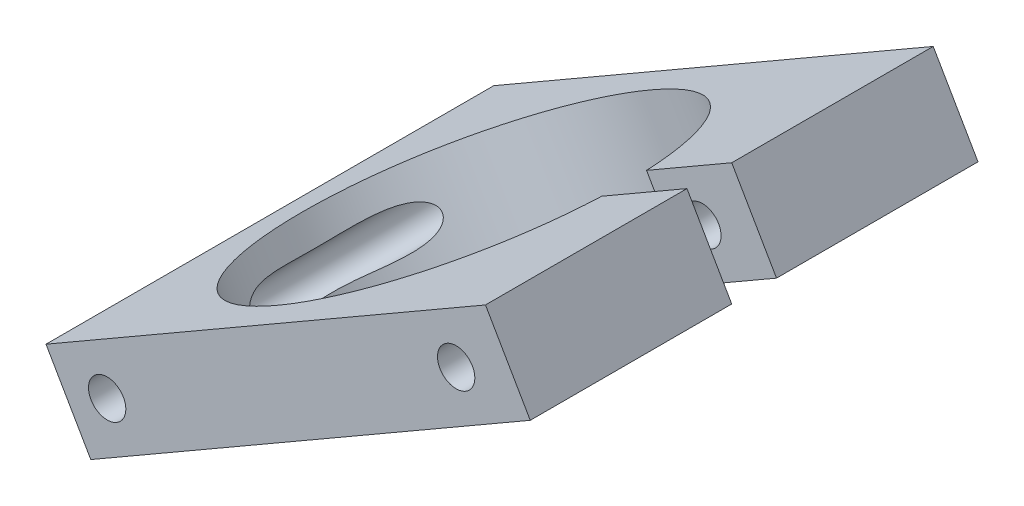
ISO-10303-21;
HEADER;
FILE_DESCRIPTION(('STEP AP214'),'2;1');
FILE_NAME('part.step','',(''),(''),'','','');
FILE_SCHEMA(('AUTOMOTIVE_DESIGN { 1 0 10303 214 1 1 1 1 }'));
ENDSEC;
DATA;
#1=APPLICATION_CONTEXT('core data for automotive mechanical design processes');
#2=APPLICATION_PROTOCOL_DEFINITION('international standard','automotive_design',2000,#1);
#3=PRODUCT_CONTEXT('',#1,'mechanical');
#4=PRODUCT('Part','Part','',(#3));
#5=PRODUCT_RELATED_PRODUCT_CATEGORY('part','',(#4));
#6=PRODUCT_DEFINITION_FORMATION('','',#4);
#7=PRODUCT_DEFINITION_CONTEXT('part definition',#1,'design');
#8=PRODUCT_DEFINITION('design','',#6,#7);
#9=PRODUCT_DEFINITION_SHAPE('','',#8);
#10=(LENGTH_UNIT() NAMED_UNIT(*) SI_UNIT(.MILLI.,.METRE.));
#11=(NAMED_UNIT(*) PLANE_ANGLE_UNIT() SI_UNIT($,.RADIAN.));
#12=(NAMED_UNIT(*) SI_UNIT($,.STERADIAN.) SOLID_ANGLE_UNIT());
#13=UNCERTAINTY_MEASURE_WITH_UNIT(LENGTH_MEASURE(1.E-05),#10,'distance_accuracy_value','');
#14=(GEOMETRIC_REPRESENTATION_CONTEXT(3) GLOBAL_UNCERTAINTY_ASSIGNED_CONTEXT((#13)) GLOBAL_UNIT_ASSIGNED_CONTEXT((#10,
#11,#12)) REPRESENTATION_CONTEXT('',''));
#15=CARTESIAN_POINT('',(0.,0.,0.));
#16=DIRECTION('',(0.,0.,1.));
#17=DIRECTION('',(1.,0.,0.));
#18=AXIS2_PLACEMENT_3D('',#15,#16,#17);
#19=CARTESIAN_POINT('',(53.9903810567648,603.817929175895,-386.357743681072));
#20=DIRECTION('',(0.,0.,-1.));
#21=DIRECTION('',(0.,1.,0.));
#22=AXIS2_PLACEMENT_3D('',#19,#20,#21);
#23=CYLINDRICAL_SURFACE('',#22,1.25);
#24=CARTESIAN_POINT('',(53.9903810567648,603.817929175895,-387.857743681072));
#25=DIRECTION('',(0.,0.,-1.));
#26=DIRECTION('',(0.,1.,0.));
#27=AXIS2_PLACEMENT_3D('',#24,#25,#26);
#28=CIRCLE('',#27,1.25);
#29=CARTESIAN_POINT('',(53.9903810567648,605.067929175895,-387.857743681072));
#30=VERTEX_POINT('',#29);
#31=EDGE_CURVE('E129',#30,#30,#28,.T.);
#32=ORIENTED_EDGE('',*,*,#31,.F.);
#33=EDGE_LOOP('',(#32));
#34=FACE_BOUND('',#33,.T.);
#35=CARTESIAN_POINT('',(53.9903810567648,603.817929175895,-401.357743681072));
#36=DIRECTION('',(0.,0.,-1.));
#37=DIRECTION('',(0.,1.,0.));
#38=AXIS2_PLACEMENT_3D('',#35,#36,#37);
#39=CIRCLE('',#38,1.25);
#40=CARTESIAN_POINT('',(53.9903810567648,605.067929175895,-401.357743681072));
#41=VERTEX_POINT('',#40);
#42=EDGE_CURVE('E147',#41,#41,#39,.T.);
#43=ORIENTED_EDGE('',*,*,#42,.T.);
#44=EDGE_LOOP('',(#43));
#45=FACE_BOUND('',#44,.T.);
#46=ADVANCED_FACE('F17',(#34,#45),#23,.F.);
#47=CARTESIAN_POINT('',(30.6076951545847,590.317929175895,-386.357743681072));
#48=DIRECTION('',(0.,0.,-1.));
#49=DIRECTION('',(0.,1.,0.));
#50=AXIS2_PLACEMENT_3D('',#47,#48,#49);
#51=CYLINDRICAL_SURFACE('',#50,1.25);
#52=CARTESIAN_POINT('',(31.6902269093152,590.942929175895,-392.736419092158));
#53=CARTESIAN_POINT('',(31.6712542976846,590.975786607273,-392.736415954482));
#54=CARTESIAN_POINT('',(31.6507622655719,591.007794771316,-392.733481741806));
#55=CARTESIAN_POINT('',(31.6074845193842,591.069152555091,-392.721998875564));
#56=CARTESIAN_POINT('',(31.5846961443096,591.098499013884,-392.713443643527));
#57=CARTESIAN_POINT('',(31.5378354571019,591.153778877972,-392.691473109543));
#58=CARTESIAN_POINT('',(31.5137727967481,591.179733883564,-392.678090836825));
#59=CARTESIAN_POINT('',(31.4649407412493,591.228324003287,-392.647285870885));
#60=CARTESIAN_POINT('',(31.4401711547139,591.250958207975,-392.629862074201));
#61=CARTESIAN_POINT('',(31.3739636054957,591.307004384488,-392.579119477516));
#62=CARTESIAN_POINT('',(31.3323627876158,591.3376123219,-392.542921400854));
#63=CARTESIAN_POINT('',(31.2501250278874,591.391340505114,-392.464366687458));
#64=CARTESIAN_POINT('',(31.2094915239816,591.414436930233,-392.421991063912));
#65=CARTESIAN_POINT('',(31.135477312987,591.451688723698,-392.339239642249));
#66=CARTESIAN_POINT('',(31.1018751560205,591.466641648179,-392.299408491014));
#67=CARTESIAN_POINT('',(31.0360801007506,591.492764403902,-392.217390405548));
#68=CARTESIAN_POINT('',(31.0038882991716,591.503931334993,-392.175201694062));
#69=CARTESIAN_POINT('',(30.9094768450197,591.53274747688,-392.045880474075));
#70=CARTESIAN_POINT('',(30.8494881663362,591.545681126031,-391.956069829444));
#71=CARTESIAN_POINT('',(30.7340969321448,591.562915335412,-391.769982309982));
#72=CARTESIAN_POINT('',(30.6788363192433,591.567004578957,-391.673602763512));
#73=CARTESIAN_POINT('',(30.5739986263102,591.568573337009,-391.477666883313));
#74=CARTESIAN_POINT('',(30.5244276143748,591.566045861762,-391.378107299982));
#75=CARTESIAN_POINT('',(30.4304649274881,591.556203632444,-391.176546350129));
#76=CARTESIAN_POINT('',(30.3860863273504,591.548877087328,-391.074539567204));
#77=CARTESIAN_POINT('',(30.3022244517657,591.530787142865,-390.868903153365));
#78=CARTESIAN_POINT('',(30.262739190048,591.5200251444,-390.765274200277));
#79=CARTESIAN_POINT('',(30.1813897125954,591.493901348095,-390.537516039531));
#80=CARTESIAN_POINT('',(30.1404243554549,591.478057557332,-390.413122917611));
#81=CARTESIAN_POINT('',(30.0641719972323,591.444347443082,-390.162862736092));
#82=CARTESIAN_POINT('',(30.0288864687356,591.426480597123,-390.036995303299));
#83=CARTESIAN_POINT('',(29.9634520294908,591.389777779715,-389.783935760656));
#84=CARTESIAN_POINT('',(29.933308553843,591.37094080989,-389.656742398103));
#85=CARTESIAN_POINT('',(29.8777398026052,591.3332075794,-389.401332739715));
#86=CARTESIAN_POINT('',(29.8523150743084,591.314311312115,-389.273116327021));
#87=CARTESIAN_POINT('',(29.7824933425284,591.258726160872,-388.887180746345));
#88=CARTESIAN_POINT('',(29.7445347151282,591.223132096093,-388.628119188459));
#89=CARTESIAN_POINT('',(29.6829672398777,591.160140124865,-388.107524553005));
#90=CARTESIAN_POINT('',(29.6593477252184,591.132736133576,-387.845993459963));
#91=CARTESIAN_POINT('',(29.6282046773068,591.094814305465,-387.379873878629));
#92=CARTESIAN_POINT('',(29.6182618788655,591.081889914004,-387.175640818059));
#93=CARTESIAN_POINT('',(29.6050941641375,591.064531071613,-386.766852730233));
#94=CARTESIAN_POINT('',(29.6018606041002,591.060085697459,-386.562298457445));
#95=CARTESIAN_POINT('',(29.6018603748356,591.060086142896,-386.148294362564));
#96=CARTESIAN_POINT('',(29.6052502953014,591.064747254184,-385.938844516084));
#97=CARTESIAN_POINT('',(29.6190549460035,591.082924661318,-385.52052600228));
#98=CARTESIAN_POINT('',(29.6294711089759,591.096442763197,-385.311657462217));
#99=CARTESIAN_POINT('',(29.658076028985,591.131087882679,-384.894287188887));
#100=CARTESIAN_POINT('',(29.6762943687451,591.152243811433,-384.685789915798));
#101=CARTESIAN_POINT('',(29.7215678150664,591.200178409304,-384.270439728651));
#102=CARTESIAN_POINT('',(29.7486216006178,591.226956237664,-384.063586573509));
#103=CARTESIAN_POINT('',(29.8130861500548,591.28382452542,-383.650786127465));
#104=CARTESIAN_POINT('',(29.8505522047719,591.313932137849,-383.444849807547));
#105=CARTESIAN_POINT('',(29.9374406087149,591.374372659823,-383.035347622215));
#106=CARTESIAN_POINT('',(29.9868704257778,591.404705698572,-382.831783320938));
#107=CARTESIAN_POINT('',(30.071224417899,591.447387035147,-382.529666772488));
#108=CARTESIAN_POINT('',(30.100923862872,591.46110183001,-382.429839224293));
#109=CARTESIAN_POINT('',(30.1640212471644,591.487039792191,-382.231169680477));
#110=CARTESIAN_POINT('',(30.1974186295211,591.499263183554,-382.132327538877));
#111=CARTESIAN_POINT('',(30.2681689260807,591.521505194476,-381.935954464242));
#112=CARTESIAN_POINT('',(30.3055167369318,591.531526608344,-381.838422018587));
#113=CARTESIAN_POINT('',(30.3845258600304,591.54851049702,-381.644865434439));
#114=CARTESIAN_POINT('',(30.4261855148307,591.555474141858,-381.548840732605));
#115=CARTESIAN_POINT('',(30.4915703676895,591.562708754496,-381.407594903611));
#116=CARTESIAN_POINT('',(30.5135098514463,591.56458003398,-381.361625675436));
#117=CARTESIAN_POINT('',(30.5585386694158,591.567165561227,-381.270224064769));
#118=CARTESIAN_POINT('',(30.5816280029285,591.567879809696,-381.22479168195));
#119=CARTESIAN_POINT('',(30.6529122679509,591.568021555181,-381.08900017262));
#120=CARTESIAN_POINT('',(30.7029352535289,591.565423978407,-380.999556589138));
#121=CARTESIAN_POINT('',(30.7902518241659,591.555018581878,-380.854071291457));
#122=CARTESIAN_POINT('',(30.8260936799124,591.549281563499,-380.797008844043));
#123=CARTESIAN_POINT('',(30.9001323912273,591.53382970333,-380.684891357617));
#124=CARTESIAN_POINT('',(30.9383309692258,591.524111922202,-380.62983783475));
#125=CARTESIAN_POINT('',(31.0168005631336,591.499796466121,-380.522877801885));
#126=CARTESIAN_POINT('',(31.0570564481365,591.485231011005,-380.470953118648));
#127=CARTESIAN_POINT('',(31.1396640890967,591.449973114851,-380.371063361451));
#128=CARTESIAN_POINT('',(31.1820113767418,591.429293302462,-380.323090384193));
#129=CARTESIAN_POINT('',(31.2563160516613,591.387073856797,-380.245411655401));
#130=CARTESIAN_POINT('',(31.2878810881587,591.367378957239,-380.214340262311));
#131=CARTESIAN_POINT('',(31.3515011473762,591.323290089821,-380.156136231997));
#132=CARTESIAN_POINT('',(31.3835565246722,591.298892557627,-380.129006609948));
#133=CARTESIAN_POINT('',(31.4478033378294,591.24448844767,-380.079785112983));
#134=CARTESIAN_POINT('',(31.4799914501878,591.214415452017,-380.057760582643));
#135=CARTESIAN_POINT('',(31.5427764337926,591.148691126009,-380.021039072499));
#136=CARTESIAN_POINT('',(31.5733783461319,591.11305912214,-380.006317418105));
#137=CARTESIAN_POINT('',(31.6181326825975,591.054272423855,-379.990478000768));
#138=CARTESIAN_POINT('',(31.6334395478382,591.032808016431,-379.986218317071));
#139=CARTESIAN_POINT('',(31.6628196698266,590.988685419216,-379.980512329085));
#140=CARTESIAN_POINT('',(31.6768928760688,590.96602718061,-379.979066139927));
#141=CARTESIAN_POINT('',(31.7091967582174,590.910068476414,-379.979071300344));
#142=CARTESIAN_POINT('',(31.7266705410666,590.876317702282,-379.982005689429));
#143=CARTESIAN_POINT('',(31.7581687018654,590.808159526799,-379.993488795394));
#144=CARTESIAN_POINT('',(31.7721891260331,590.773751420964,-380.002043906785));
#145=CARTESIAN_POINT('',(31.7966323535406,590.705529579073,-380.024014189993));
#146=CARTESIAN_POINT('',(31.8070786498028,590.671713404607,-380.037396388754));
#147=CARTESIAN_POINT('',(31.8247429142316,590.605128560024,-380.068201318227));
#148=CARTESIAN_POINT('',(31.8319599667148,590.572360189466,-380.085625192871));
#149=CARTESIAN_POINT('',(31.8473937604114,590.486998854148,-380.136368272726));
#150=CARTESIAN_POINT('',(31.8531006213553,590.435666918969,-380.172566850275));
#151=CARTESIAN_POINT('',(31.8585115615589,590.337582954619,-380.251121717076));
#152=CARTESIAN_POINT('',(31.8581968783765,590.290845696759,-380.29349684461));
#153=CARTESIAN_POINT('',(31.8534509107869,590.208124016238,-380.376245861509));
#154=CARTESIAN_POINT('',(31.8495997115077,590.171548926378,-380.416075004242));
#155=CARTESIAN_POINT('',(31.8393259047053,590.10151046885,-380.498088865035));
#156=CARTESIAN_POINT('',(31.8329013350788,590.068049499634,-380.540275359322));
#157=CARTESIAN_POINT('',(31.8106513472265,589.971876322429,-380.669598135095));
#158=CARTESIAN_POINT('',(31.7918570672581,589.913454705524,-380.759413054181));
#159=CARTESIAN_POINT('',(31.7490816953565,589.804893117378,-380.945522413983));
#160=CARTESIAN_POINT('',(31.7249878923575,589.75498311172,-381.041920146693));
#161=CARTESIAN_POINT('',(31.6739172467335,589.663393006969,-381.237892890135));
#162=CARTESIAN_POINT('',(31.6469373966145,589.621721624509,-381.337471137941));
#163=CARTESIAN_POINT('',(31.5914315935445,589.545274155638,-381.539032702268));
#164=CARTESIAN_POINT('',(31.5629025186309,589.510512704147,-381.641020622149));
#165=CARTESIAN_POINT('',(31.505315506728,589.446944784819,-381.846620245664));
#166=CARTESIAN_POINT('',(31.4762577812007,589.418135990505,-381.950231297833));
#167=CARTESIAN_POINT('',(31.4129869149723,589.360772339797,-382.17788961091));
#168=CARTESIAN_POINT('',(31.3788056637688,589.333233094423,-382.302199793624));
#169=CARTESIAN_POINT('',(31.3115288529095,589.284076376724,-382.552292242471));
#170=CARTESIAN_POINT('',(31.2784335750355,589.262460430811,-382.678074879359));
#171=CARTESIAN_POINT('',(31.2139713348997,589.224157657381,-382.930953895139));
#172=CARTESIAN_POINT('',(31.1826060898681,589.207475658138,-383.058051435751));
#173=CARTESIAN_POINT('',(31.1221789780482,589.17822290843,-383.313268281298));
#174=CARTESIAN_POINT('',(31.0931173752639,589.165652628666,-383.441387701498));
#175=CARTESIAN_POINT('',(31.0100348830674,589.132945725912,-383.82736212664));
#176=CARTESIAN_POINT('',(30.9601875238648,589.117850764193,-384.086561571914));
#177=CARTESIAN_POINT('',(30.8747680573524,589.095996260358,-384.607521193495));
#178=CARTESIAN_POINT('',(30.8391895527119,589.089232979973,-384.869280168213));
#179=CARTESIAN_POINT('',(30.7957598230708,589.082053737164,-385.287386094102));
#180=CARTESIAN_POINT('',(30.7825184842412,589.080173863518,-385.443161407016));
#181=CARTESIAN_POINT('',(30.7621789167057,589.077468024626,-385.755131046195));
#182=CARTESIAN_POINT('',(30.7550807835504,589.076642075772,-385.91132537894));
#183=CARTESIAN_POINT('',(30.7472243564328,589.075734872899,-386.223906715576));
#184=CARTESIAN_POINT('',(30.7464673281852,589.075653767554,-386.380293751702));
#185=CARTESIAN_POINT('',(30.751316475123,589.076205003683,-386.692965774246));
#186=CARTESIAN_POINT('',(30.7569225800334,589.076837337279,-386.849250761774));
#187=CARTESIAN_POINT('',(30.7743294434003,589.079055010686,-387.161202639928));
#188=CARTESIAN_POINT('',(30.7861197716331,589.080638746528,-387.31687012797));
#189=CARTESIAN_POINT('',(30.8155808184862,589.085247061452,-387.627630114726));
#190=CARTESIAN_POINT('',(30.8332517750603,589.088271698841,-387.782722589915));
#191=CARTESIAN_POINT('',(30.8740350057707,589.096456737677,-388.092087801964));
#192=CARTESIAN_POINT('',(30.8971457720606,589.101616547582,-388.246360753889));
#193=CARTESIAN_POINT('',(30.9482801222771,589.114932985222,-388.553945229169));
#194=CARTESIAN_POINT('',(30.9763031769517,589.123089290217,-388.707256854257));
#195=CARTESIAN_POINT('',(31.0280913344314,589.140522389102,-388.969429208505));
#196=CARTESIAN_POINT('',(31.0508092534244,589.148824977715,-389.078562324954));
#197=CARTESIAN_POINT('',(31.0981902300189,589.167901228078,-389.296165819672));
#198=CARTESIAN_POINT('',(31.1228530019451,589.178674527353,-389.404636292763));
#199=CARTESIAN_POINT('',(31.1994393704343,589.215399913258,-389.72929475983));
#200=CARTESIAN_POINT('',(31.2539026929711,589.245740629649,-389.944441170725));
#201=CARTESIAN_POINT('',(31.3436897256474,589.30677683686,-390.283773312812));
#202=CARTESIAN_POINT('',(31.3777505744604,589.332271345495,-390.409238007981));
#203=CARTESIAN_POINT('',(31.44642090134,589.389997929595,-390.65844368276));
#204=CARTESIAN_POINT('',(31.4810302080519,589.422227937597,-390.782185178901));
#205=CARTESIAN_POINT('',(31.5496257135583,589.494674111143,-391.027060577142));
#206=CARTESIAN_POINT('',(31.5836135225004,589.534864986743,-391.148201423692));
#207=CARTESIAN_POINT('',(31.6495384134478,589.624972363854,-391.387333716643));
#208=CARTESIAN_POINT('',(31.6814776591947,589.674878371377,-391.505328406447));
#209=CARTESIAN_POINT('',(31.7303992342028,589.766843698571,-391.695652926489));
#210=CARTESIAN_POINT('',(31.7486683798876,589.805407249645,-391.769334634444));
#211=CARTESIAN_POINT('',(31.7824256430866,589.888370252853,-391.914179772449));
#212=CARTESIAN_POINT('',(31.7979104456304,589.932776553764,-391.985340120787));
#213=CARTESIAN_POINT('',(31.8247881526732,590.02864350687,-392.124417879131));
#214=CARTESIAN_POINT('',(31.8361504443113,590.08015316599,-392.192307906016));
#215=CARTESIAN_POINT('',(31.8524913382811,590.19097632579,-392.322241559134));
#216=CARTESIAN_POINT('',(31.8574866480543,590.250268949999,-392.384300089147));
#217=CARTESIAN_POINT('',(31.8578021233147,590.349641328038,-392.473973059981));
#218=CARTESIAN_POINT('',(31.8563949655879,590.386802718807,-392.504793571012));
#219=CARTESIAN_POINT('',(31.849749309907,590.46386877813,-392.562471875908));
#220=CARTESIAN_POINT('',(31.8445087033643,590.503774945499,-392.589327479102));
#221=CARTESIAN_POINT('',(31.8292405689891,590.586474730671,-392.637985922234));
#222=CARTESIAN_POINT('',(31.8191532629342,590.629298513959,-392.659720470505));
#223=CARTESIAN_POINT('',(31.7933744397022,590.716300954233,-392.695856818427));
#224=CARTESIAN_POINT('',(31.777702463367,590.760474402097,-392.710283766546));
#225=CARTESIAN_POINT('',(31.7492484297674,590.827840029359,-392.725572200945));
#226=CARTESIAN_POINT('',(31.7385261951859,590.851211329805,-392.729622326244));
#227=CARTESIAN_POINT('',(31.7155162076754,590.897497777168,-392.735046964606));
#228=CARTESIAN_POINT('',(31.7032283171439,590.920412883786,-392.736421242321));
#229=CARTESIAN_POINT('',(31.6902269093152,590.942929175895,-392.736419092158));
#230=B_SPLINE_CURVE_WITH_KNOTS('',3,(#52,#53,#54,#55,#56,#57,#58,#59,#60,#61,#62,#63,#64,#65,
#66,#67,#68,#69,#70,#71,#72,#73,#74,#75,#76,#77,#78,#79,#80,#81,#82,#83,#84,#85,#86,#87,#88,#89,
#90,#91,#92,#93,#94,#95,#96,#97,#98,#99,#100,#101,#102,#103,#104,#105,#106,#107,#108,#109,#110,
#111,#112,#113,#114,#115,#116,#117,#118,#119,#120,#121,#122,#123,#124,#125,#126,#127,#128,#129,
#130,#131,#132,#133,#134,#135,#136,#137,#138,#139,#140,#141,#142,#143,#144,#145,#146,#147,#148,
#149,#150,#151,#152,#153,#154,#155,#156,#157,#158,#159,#160,#161,#162,#163,#164,#165,#166,#167,
#168,#169,#170,#171,#172,#173,#174,#175,#176,#177,#178,#179,#180,#181,#182,#183,#184,#185,#186,
#187,#188,#189,#190,#191,#192,#193,#194,#195,#196,#197,#198,#199,#200,#201,#202,#203,#204,#205,
#206,#207,#208,#209,#210,#211,#212,#213,#214,#215,#216,#217,#218,#219,#220,#221,#222,#223,#224,
#225,#226,#227,#228,#229),.UNSPECIFIED.,.T.,.F.,(4,2,2,2,2,2,2,2,2,2,2,2,2,2,2,2,2,2,2,2,2,2,2,
2,2,2,2,2,2,2,2,2,2,2,2,2,2,2,2,2,2,2,2,2,2,2,2,2,2,2,2,2,2,2,2,2,2,2,2,2,2,2,2,2,2,2,2,2,2,2,2,
2,2,2,2,2,2,2,2,2,2,2,2,2,2,2,2,2,4),(0.,0.113721890322113,0.22757711090348,0.340667608492749,
0.453789019754883,0.641912274934925,0.830626422084285,0.993034505980874,1.1555667182889,
1.48094764319103,1.8140206610741,2.14744567180063,2.4816929774268,2.81580416015053,
3.21138556181623,3.60706935960646,4.00316883417094,4.39931422076172,5.19142999368265,
5.98295579047496,6.5973378339562,7.21092785445144,7.83919972330965,8.46759974317051,
9.09840379712595,9.72911358112095,10.3632387257238,10.9977607197235,11.3128502480869,
11.6278923838019,11.9425323919409,12.2570519003811,12.4099373098438,12.5628226262341,
12.8699456203727,13.0726891086871,13.2755825705648,13.4771535795313,13.6783111360099,
13.8234251775952,13.9686496432008,14.1156928119731,14.2622357159916,14.342169629119,
14.422106813177,14.5358305661646,14.649683923534,14.7627738543585,14.8758958326349,
15.0640213961674,15.2527332326041,15.4151334377518,15.5776577036934,15.9030544333831,
16.2361888414609,16.5696738482144,16.9038578068534,17.2379109083135,17.6332305486884,
18.0286519658362,18.4244590647182,18.8203114588481,19.6128646814015,20.4050621705397,
20.8739969727795,21.3429390686485,21.8119747653572,22.2810052820382,22.7492472701274,
23.2175082074618,23.6856395013128,24.1537203894598,24.4890183952029,24.8242672411837,
25.4956485398557,25.8929566697944,26.2901430246809,26.6860872769548,27.081606192015,
27.3368315385907,27.5923587667408,27.8497464209335,28.1064572705239,28.2510537321592,
28.3957297889417,28.542237933887,28.6882383986824,28.7661620224346,28.8440924994774),.UNSPECIFIED.);
#231=CARTESIAN_POINT('',(31.6902269093152,590.942929175895,-392.736419092158));
#232=VERTEX_POINT('',#231);
#233=EDGE_CURVE('E88',#232,#232,#230,.T.);
#234=ORIENTED_EDGE('',*,*,#233,.T.);
#235=EDGE_LOOP('',(#234));
#236=FACE_BOUND('',#235,.T.);
#237=CARTESIAN_POINT('',(30.6076951545847,590.317929175895,-401.357743681072));
#238=DIRECTION('',(0.,0.,-1.));
#239=DIRECTION('',(0.,1.,0.));
#240=AXIS2_PLACEMENT_3D('',#237,#238,#239);
#241=CIRCLE('',#240,1.25);
#242=CARTESIAN_POINT('',(30.6076951545847,591.567929175895,-401.357743681072));
#243=VERTEX_POINT('',#242);
#244=EDGE_CURVE('E144',#243,#243,#241,.T.);
#245=ORIENTED_EDGE('',*,*,#244,.T.);
#246=EDGE_LOOP('',(#245));
#247=FACE_BOUND('',#246,.T.);
#248=CARTESIAN_POINT('',(30.6076951545847,590.317929175895,-371.357743681072));
#249=DIRECTION('',(0.,0.,-1.));
#250=DIRECTION('',(0.,1.,0.));
#251=AXIS2_PLACEMENT_3D('',#248,#249,#250);
#252=CIRCLE('',#251,1.25);
#253=CARTESIAN_POINT('',(30.6076951545847,591.567929175895,-371.357743681072));
#254=VERTEX_POINT('',#253);
#255=EDGE_CURVE('E139',#254,#254,#252,.F.);
#256=ORIENTED_EDGE('',*,*,#255,.T.);
#257=EDGE_LOOP('',(#256));
#258=FACE_BOUND('',#257,.T.);
#259=ADVANCED_FACE('F156',(#236,#247,#258),#51,.F.);
#260=CARTESIAN_POINT('',(55.9544826719027,608.416005387248,-371.357743681072));
#261=DIRECTION('',(-0.500000000000001,0.866025403784438,0.));
#262=DIRECTION('',(-0.866025403784438,-0.500000000000001,0.));
#263=AXIS2_PLACEMENT_3D('',#260,#261,#262);
#264=PLANE('',#263);
#265=DIRECTION('',(0.866025403784439,0.499999999999999,0.));
#266=VECTOR('',#265,1.);
#267=CARTESIAN_POINT('',(26.5096189432315,591.416005387248,-371.357743681072));
#268=LINE('',#267,#266);
#269=CARTESIAN_POINT('',(26.5096189432315,591.416005387248,-371.357743681072));
#270=VERTEX_POINT('',#269);
#271=CARTESIAN_POINT('',(55.9544826719024,608.416005387248,-371.357743681072));
#272=VERTEX_POINT('',#271);
#273=EDGE_CURVE('E109',#270,#272,#268,.T.);
#274=ORIENTED_EDGE('',*,*,#273,.T.);
#275=DIRECTION('',(0.,0.,1.));
#276=VECTOR('',#275,1.);
#277=CARTESIAN_POINT('',(55.9544826719024,608.416005387248,-384.857743681072));
#278=LINE('',#277,#276);
#279=CARTESIAN_POINT('',(55.9544826719025,608.416005387248,-384.857743681072));
#280=VERTEX_POINT('',#279);
#281=EDGE_CURVE('E94',#272,#280,#278,.F.);
#282=ORIENTED_EDGE('',*,*,#281,.T.);
#283=DIRECTION('',(0.86602540378448,0.499999999999929,0.));
#284=VECTOR('',#283,1.);
#285=CARTESIAN_POINT('',(50.2470926301003,605.120842210244,-384.857743681072));
#286=LINE('',#285,#284);
#287=CARTESIAN_POINT('',(50.2470926301006,605.120842210243,-384.857743681072));
#288=VERTEX_POINT('',#287);
#289=EDGE_CURVE('E90',#288,#280,#286,.T.);
#290=ORIENTED_EDGE('',*,*,#289,.F.);
#291=CARTESIAN_POINT('',(39.4999999999981,598.916005387249,-386.357743681072));
#292=DIRECTION('',(0.499999999999999,-0.866025403784439,0.));
#293=DIRECTION('',(0.866025403784439,0.499999999999999,0.));
#294=AXIS2_PLACEMENT_3D('',#291,#292,#293);
#295=CIRCLE('',#294,12.5);
#296=CARTESIAN_POINT('',(50.2470926301006,605.120842210243,-387.857743681072));
#297=VERTEX_POINT('',#296);
#298=EDGE_CURVE('E20',#288,#297,#295,.T.);
#299=ORIENTED_EDGE('',*,*,#298,.T.);
#300=DIRECTION('',(-0.86602540378448,-0.499999999999929,0.));
#301=VECTOR('',#300,1.);
#302=CARTESIAN_POINT('',(55.9544826719025,608.416005387248,-387.857743681072));
#303=LINE('',#302,#301);
#304=CARTESIAN_POINT('',(55.9544826719024,608.416005387248,-387.857743681072));
#305=VERTEX_POINT('',#304);
#306=EDGE_CURVE('E132',#305,#297,#303,.T.);
#307=ORIENTED_EDGE('',*,*,#306,.F.);
#308=DIRECTION('',(0.,0.,1.));
#309=VECTOR('',#308,1.);
#310=CARTESIAN_POINT('',(55.9544826719024,608.416005387248,-401.357743681072));
#311=LINE('',#310,#309);
#312=CARTESIAN_POINT('',(55.9544826719025,608.416005387248,-401.357743681072));
#313=VERTEX_POINT('',#312);
#314=EDGE_CURVE('E126',#305,#313,#311,.F.);
#315=ORIENTED_EDGE('',*,*,#314,.T.);
#316=DIRECTION('',(-0.866025403784439,-0.499999999999999,0.));
#317=VECTOR('',#316,1.);
#318=CARTESIAN_POINT('',(55.9544826719025,608.416005387248,-401.357743681072));
#319=LINE('',#318,#317);
#320=CARTESIAN_POINT('',(26.5096189432314,591.416005387248,-401.357743681072));
#321=VERTEX_POINT('',#320);
#322=EDGE_CURVE('E120',#313,#321,#319,.T.);
#323=ORIENTED_EDGE('',*,*,#322,.T.);
#324=DIRECTION('',(0.,0.,1.));
#325=VECTOR('',#324,1.);
#326=CARTESIAN_POINT('',(26.5096189432314,591.416005387248,-401.357743681072));
#327=LINE('',#326,#325);
#328=EDGE_CURVE('E115',#321,#270,#327,.T.);
#329=ORIENTED_EDGE('',*,*,#328,.T.);
#330=EDGE_LOOP('',(#274,#282,#290,#299,#307,#315,#323,#329));
#331=FACE_BOUND('',#330,.T.);
#332=ADVANCED_FACE('F92',(#331),#264,.T.);
#333=CARTESIAN_POINT('',(53.9903810567648,603.817929175895,-386.357743681072));
#334=DIRECTION('',(0.,0.,-1.));
#335=DIRECTION('',(0.,1.,0.));
#336=AXIS2_PLACEMENT_3D('',#333,#334,#335);
#337=CYLINDRICAL_SURFACE('',#336,1.25);
#338=CARTESIAN_POINT('',(53.9903810567648,603.817929175895,-371.357743681072));
#339=DIRECTION('',(0.,0.,-1.));
#340=DIRECTION('',(0.,1.,0.));
#341=AXIS2_PLACEMENT_3D('',#338,#339,#340);
#342=CIRCLE('',#341,1.25);
#343=CARTESIAN_POINT('',(53.9903810567648,605.067929175895,-371.357743681072));
#344=VERTEX_POINT('',#343);
#345=EDGE_CURVE('E111',#344,#344,#342,.F.);
#346=ORIENTED_EDGE('',*,*,#345,.T.);
#347=EDGE_LOOP('',(#346));
#348=FACE_BOUND('',#347,.T.);
#349=CARTESIAN_POINT('',(53.9903810567648,603.817929175895,-384.857743681072));
#350=DIRECTION('',(0.,0.,-1.));
#351=DIRECTION('',(0.,1.,0.));
#352=AXIS2_PLACEMENT_3D('',#349,#350,#351);
#353=CIRCLE('',#352,1.25);
#354=CARTESIAN_POINT('',(53.9903810567648,605.067929175895,-384.857743681072));
#355=VERTEX_POINT('',#354);
#356=EDGE_CURVE('E95',#355,#355,#353,.F.);
#357=ORIENTED_EDGE('',*,*,#356,.F.);
#358=EDGE_LOOP('',(#357));
#359=FACE_BOUND('',#358,.T.);
#360=ADVANCED_FACE('F164',(#348,#359),#337,.F.);
#361=CARTESIAN_POINT('',(40.9999999999982,596.317929175895,-386.357743681072));
#362=DIRECTION('',(0.499999999999999,-0.866025403784439,0.));
#363=DIRECTION('',(0.866025403784439,0.499999999999999,0.));
#364=AXIS2_PLACEMENT_3D('',#361,#362,#363);
#365=CYLINDRICAL_SURFACE('',#364,12.5);
#366=ORIENTED_EDGE('',*,*,#233,.F.);
#367=EDGE_LOOP('',(#366));
#368=FACE_BOUND('',#367,.T.);
#369=CARTESIAN_POINT('',(42.4999999999982,593.719852964542,-386.357743681072));
#370=DIRECTION('',(0.499999999999999,-0.866025403784439,0.));
#371=DIRECTION('',(0.866025403784439,0.499999999999999,0.));
#372=AXIS2_PLACEMENT_3D('',#369,#370,#371);
#373=CIRCLE('',#372,12.5);
#374=CARTESIAN_POINT('',(53.2470926301003,599.924689787537,-384.857743681072));
#375=VERTEX_POINT('',#374);
#376=CARTESIAN_POINT('',(53.2470926301003,599.924689787537,-387.857743681072));
#377=VERTEX_POINT('',#376);
#378=EDGE_CURVE('E98',#375,#377,#373,.T.);
#379=ORIENTED_EDGE('',*,*,#378,.T.);
#380=DIRECTION('',(0.499999999999975,-0.866025403784453,0.));
#381=VECTOR('',#380,1.);
#382=CARTESIAN_POINT('',(50.2470926301003,605.120842210244,-387.857743681072));
#383=LINE('',#382,#381);
#384=EDGE_CURVE('E84',#297,#377,#383,.T.);
#385=ORIENTED_EDGE('',*,*,#384,.F.);
#386=ORIENTED_EDGE('',*,*,#298,.F.);
#387=DIRECTION('',(-0.499999999999975,0.866025403784453,0.));
#388=VECTOR('',#387,1.);
#389=CARTESIAN_POINT('',(53.2470926301003,599.924689787537,-384.857743681072));
#390=LINE('',#389,#388);
#391=EDGE_CURVE('E83',#375,#288,#390,.T.);
#392=ORIENTED_EDGE('',*,*,#391,.F.);
#393=EDGE_LOOP('',(#379,#385,#386,#392));
#394=FACE_BOUND('',#393,.T.);
#395=ADVANCED_FACE('F82',(#368,#394),#365,.F.);
#396=CARTESIAN_POINT('',(55.2894191624414,604.567929175895,-387.857743681072));
#397=DIRECTION('',(0.,0.,1.));
#398=DIRECTION('',(1.,0.,0.));
#399=AXIS2_PLACEMENT_3D('',#396,#397,#398);
#400=PLANE('',#399);
#401=ORIENTED_EDGE('',*,*,#31,.T.);
#402=EDGE_LOOP('',(#401));
#403=FACE_BOUND('',#402,.T.);
#404=ORIENTED_EDGE('',*,*,#384,.T.);
#405=DIRECTION('',(-0.866025403784438,-0.500000000000001,0.));
#406=VECTOR('',#405,1.);
#407=CARTESIAN_POINT('',(58.9544826719025,603.219852964542,-387.857743681072));
#408=LINE('',#407,#406);
#409=CARTESIAN_POINT('',(58.9544826719024,603.219852964542,-387.857743681072));
#410=VERTEX_POINT('',#409);
#411=EDGE_CURVE('E137',#377,#410,#408,.F.);
#412=ORIENTED_EDGE('',*,*,#411,.T.);
#413=DIRECTION('',(0.499999999999996,-0.866025403784441,0.));
#414=VECTOR('',#413,1.);
#415=CARTESIAN_POINT('',(55.9544826719024,608.416005387248,-387.857743681072));
#416=LINE('',#415,#414);
#417=EDGE_CURVE('E123',#410,#305,#416,.F.);
#418=ORIENTED_EDGE('',*,*,#417,.T.);
#419=ORIENTED_EDGE('',*,*,#306,.T.);
#420=EDGE_LOOP('',(#404,#412,#418,#419));
#421=FACE_BOUND('',#420,.T.);
#422=ADVANCED_FACE('F163',(#403,#421),#400,.T.);
#423=CARTESIAN_POINT('',(55.9544826719024,608.416005387248,-401.357743681072));
#424=DIRECTION('',(-0.866025403784441,-0.499999999999996,0.));
#425=DIRECTION('',(0.499999999999996,-0.866025403784441,0.));
#426=AXIS2_PLACEMENT_3D('',#423,#424,#425);
#427=PLANE('',#426);
#428=DIRECTION('',(0.,0.,1.));
#429=VECTOR('',#428,1.);
#430=CARTESIAN_POINT('',(58.9544826719025,603.219852964542,-371.357743681072));
#431=LINE('',#430,#429);
#432=CARTESIAN_POINT('',(58.9544826719025,603.219852964542,-401.357743681072));
#433=VERTEX_POINT('',#432);
#434=EDGE_CURVE('E211',#410,#433,#431,.F.);
#435=ORIENTED_EDGE('',*,*,#434,.T.);
#436=DIRECTION('',(-0.500000000000047,0.866025403784412,0.));
#437=VECTOR('',#436,1.);
#438=CARTESIAN_POINT('',(58.9544826719025,603.219852964542,-401.357743681072));
#439=LINE('',#438,#437);
#440=EDGE_CURVE('E122',#433,#313,#439,.T.);
#441=ORIENTED_EDGE('',*,*,#440,.T.);
#442=ORIENTED_EDGE('',*,*,#314,.F.);
#443=ORIENTED_EDGE('',*,*,#417,.F.);
#444=EDGE_LOOP('',(#435,#441,#442,#443));
#445=FACE_BOUND('',#444,.T.);
#446=ADVANCED_FACE('F200',(#445),#427,.F.);
#447=CARTESIAN_POINT('',(68.5656986040702,591.768891070218,-401.357743681072));
#448=DIRECTION('',(0.,0.,1.));
#449=DIRECTION('',(1.,0.,0.));
#450=AXIS2_PLACEMENT_3D('',#447,#448,#449);
#451=PLANE('',#450);
#452=ORIENTED_EDGE('',*,*,#244,.F.);
#453=EDGE_LOOP('',(#452));
#454=FACE_BOUND('',#453,.T.);
#455=ORIENTED_EDGE('',*,*,#42,.F.);
#456=EDGE_LOOP('',(#455));
#457=FACE_BOUND('',#456,.T.);
#458=DIRECTION('',(-0.866025403784438,-0.500000000000001,0.));
#459=VECTOR('',#458,1.);
#460=CARTESIAN_POINT('',(58.9544826719025,603.219852964542,-401.357743681072));
#461=LINE('',#460,#459);
#462=CARTESIAN_POINT('',(29.5096189432314,586.219852964542,-401.357743681072));
#463=VERTEX_POINT('',#462);
#464=EDGE_CURVE('E216',#433,#463,#461,.T.);
#465=ORIENTED_EDGE('',*,*,#464,.T.);
#466=DIRECTION('',(-0.5,0.866025403784438,0.));
#467=VECTOR('',#466,1.);
#468=CARTESIAN_POINT('',(29.5096189432316,586.219852964541,-401.357743681072));
#469=LINE('',#468,#467);
#470=EDGE_CURVE('E117',#463,#321,#469,.T.);
#471=ORIENTED_EDGE('',*,*,#470,.T.);
#472=ORIENTED_EDGE('',*,*,#322,.F.);
#473=ORIENTED_EDGE('',*,*,#440,.F.);
#474=EDGE_LOOP('',(#465,#471,#472,#473));
#475=FACE_BOUND('',#474,.T.);
#476=ADVANCED_FACE('F197',(#454,#457,#475),#451,.F.);
#477=CARTESIAN_POINT('',(29.5096189432316,586.219852964541,-401.357743681072));
#478=DIRECTION('',(0.866025403784438,0.5,0.));
#479=DIRECTION('',(-0.5,0.866025403784438,0.));
#480=AXIS2_PLACEMENT_3D('',#477,#478,#479);
#481=PLANE('',#480);
#482=ORIENTED_EDGE('',*,*,#328,.F.);
#483=ORIENTED_EDGE('',*,*,#470,.F.);
#484=DIRECTION('',(0.,0.,1.));
#485=VECTOR('',#484,1.);
#486=CARTESIAN_POINT('',(29.5096189432315,586.219852964542,-371.357743681072));
#487=LINE('',#486,#485);
#488=CARTESIAN_POINT('',(29.5096189432315,586.219852964542,-371.357743681072));
#489=VERTEX_POINT('',#488);
#490=EDGE_CURVE('E219',#463,#489,#487,.T.);
#491=ORIENTED_EDGE('',*,*,#490,.T.);
#492=DIRECTION('',(-0.500000000000046,0.866025403784412,0.));
#493=VECTOR('',#492,1.);
#494=CARTESIAN_POINT('',(29.5096189432315,586.219852964542,-371.357743681072));
#495=LINE('',#494,#493);
#496=EDGE_CURVE('E112',#489,#270,#495,.T.);
#497=ORIENTED_EDGE('',*,*,#496,.T.);
#498=EDGE_LOOP('',(#482,#483,#491,#497));
#499=FACE_BOUND('',#498,.T.);
#500=ADVANCED_FACE('F193',(#499),#481,.F.);
#501=CARTESIAN_POINT('',(50.8432667397347,622.465043492925,-371.357743681072));
#502=DIRECTION('',(0.,0.,-1.));
#503=DIRECTION('',(-1.,0.,0.));
#504=AXIS2_PLACEMENT_3D('',#501,#502,#503);
#505=PLANE('',#504);
#506=ORIENTED_EDGE('',*,*,#255,.F.);
#507=EDGE_LOOP('',(#506));
#508=FACE_BOUND('',#507,.T.);
#509=ORIENTED_EDGE('',*,*,#345,.F.);
#510=EDGE_LOOP('',(#509));
#511=FACE_BOUND('',#510,.T.);
#512=ORIENTED_EDGE('',*,*,#273,.F.);
#513=ORIENTED_EDGE('',*,*,#496,.F.);
#514=DIRECTION('',(-0.866025403784438,-0.500000000000001,0.));
#515=VECTOR('',#514,1.);
#516=CARTESIAN_POINT('',(58.9544826719025,603.219852964542,-371.357743681072));
#517=LINE('',#516,#515);
#518=CARTESIAN_POINT('',(58.9544826719024,603.219852964542,-371.357743681072));
#519=VERTEX_POINT('',#518);
#520=EDGE_CURVE('E234',#489,#519,#517,.F.);
#521=ORIENTED_EDGE('',*,*,#520,.T.);
#522=DIRECTION('',(0.5,-0.866025403784438,0.));
#523=VECTOR('',#522,1.);
#524=CARTESIAN_POINT('',(55.9544826719024,608.416005387248,-371.357743681072));
#525=LINE('',#524,#523);
#526=EDGE_CURVE('E106',#519,#272,#525,.F.);
#527=ORIENTED_EDGE('',*,*,#526,.T.);
#528=EDGE_LOOP('',(#512,#513,#521,#527));
#529=FACE_BOUND('',#528,.T.);
#530=ADVANCED_FACE('F189',(#508,#511,#529),#505,.F.);
#531=CARTESIAN_POINT('',(55.9544826719024,608.416005387248,-384.857743681072));
#532=DIRECTION('',(-0.866025403784438,-0.5,0.));
#533=DIRECTION('',(0.5,-0.866025403784438,0.));
#534=AXIS2_PLACEMENT_3D('',#531,#532,#533);
#535=PLANE('',#534);
#536=ORIENTED_EDGE('',*,*,#281,.F.);
#537=ORIENTED_EDGE('',*,*,#526,.F.);
#538=DIRECTION('',(0.,0.,1.));
#539=VECTOR('',#538,1.);
#540=CARTESIAN_POINT('',(58.9544826719025,603.219852964542,-371.357743681072));
#541=LINE('',#540,#539);
#542=CARTESIAN_POINT('',(58.9544826719025,603.219852964542,-384.857743681072));
#543=VERTEX_POINT('',#542);
#544=EDGE_CURVE('E26',#519,#543,#541,.F.);
#545=ORIENTED_EDGE('',*,*,#544,.T.);
#546=DIRECTION('',(0.500000000000047,-0.866025403784412,0.));
#547=VECTOR('',#546,1.);
#548=CARTESIAN_POINT('',(55.9544826719025,608.416005387248,-384.857743681072));
#549=LINE('',#548,#547);
#550=EDGE_CURVE('E34',#280,#543,#549,.T.);
#551=ORIENTED_EDGE('',*,*,#550,.F.);
#552=EDGE_LOOP('',(#536,#537,#545,#551));
#553=FACE_BOUND('',#552,.T.);
#554=ADVANCED_FACE('F182',(#553),#535,.F.);
#555=CARTESIAN_POINT('',(55.2894191624414,604.567929175895,-384.857743681072));
#556=DIRECTION('',(0.,0.,-1.));
#557=DIRECTION('',(-1.,0.,0.));
#558=AXIS2_PLACEMENT_3D('',#555,#556,#557);
#559=PLANE('',#558);
#560=ORIENTED_EDGE('',*,*,#356,.T.);
#561=EDGE_LOOP('',(#560));
#562=FACE_BOUND('',#561,.T.);
#563=ORIENTED_EDGE('',*,*,#391,.T.);
#564=ORIENTED_EDGE('',*,*,#289,.T.);
#565=ORIENTED_EDGE('',*,*,#550,.T.);
#566=DIRECTION('',(-0.866025403784438,-0.500000000000001,0.));
#567=VECTOR('',#566,1.);
#568=CARTESIAN_POINT('',(58.9544826719025,603.219852964542,-384.857743681072));
#569=LINE('',#568,#567);
#570=EDGE_CURVE('E11',#543,#375,#569,.T.);
#571=ORIENTED_EDGE('',*,*,#570,.T.);
#572=EDGE_LOOP('',(#563,#564,#565,#571));
#573=FACE_BOUND('',#572,.T.);
#574=ADVANCED_FACE('F89',(#562,#573),#559,.T.);
#575=CARTESIAN_POINT('',(58.9544826719025,603.219852964542,-371.357743681072));
#576=DIRECTION('',(-0.500000000000001,0.866025403784438,0.));
#577=DIRECTION('',(-0.866025403784438,-0.500000000000001,0.));
#578=AXIS2_PLACEMENT_3D('',#575,#576,#577);
#579=PLANE('',#578);
#580=ORIENTED_EDGE('',*,*,#544,.F.);
#581=ORIENTED_EDGE('',*,*,#520,.F.);
#582=ORIENTED_EDGE('',*,*,#490,.F.);
#583=ORIENTED_EDGE('',*,*,#464,.F.);
#584=ORIENTED_EDGE('',*,*,#434,.F.);
#585=ORIENTED_EDGE('',*,*,#411,.F.);
#586=ORIENTED_EDGE('',*,*,#378,.F.);
#587=ORIENTED_EDGE('',*,*,#570,.F.);
#588=EDGE_LOOP('',(#580,#581,#582,#583,#584,#585,#586,#587));
#589=FACE_BOUND('',#588,.T.);
#590=ADVANCED_FACE('F175',(#589),#579,.F.);
#591=CLOSED_SHELL('',(#46,#259,#332,#360,#395,#422,#446,#476,#500,#530,#554,#574,#590));
#592=MANIFOLD_SOLID_BREP('B1',#591);
#593=ADVANCED_BREP_SHAPE_REPRESENTATION('',(#18,#592),#14);
#594=SHAPE_DEFINITION_REPRESENTATION(#9,#593);
ENDSEC;
END-ISO-10303-21;
